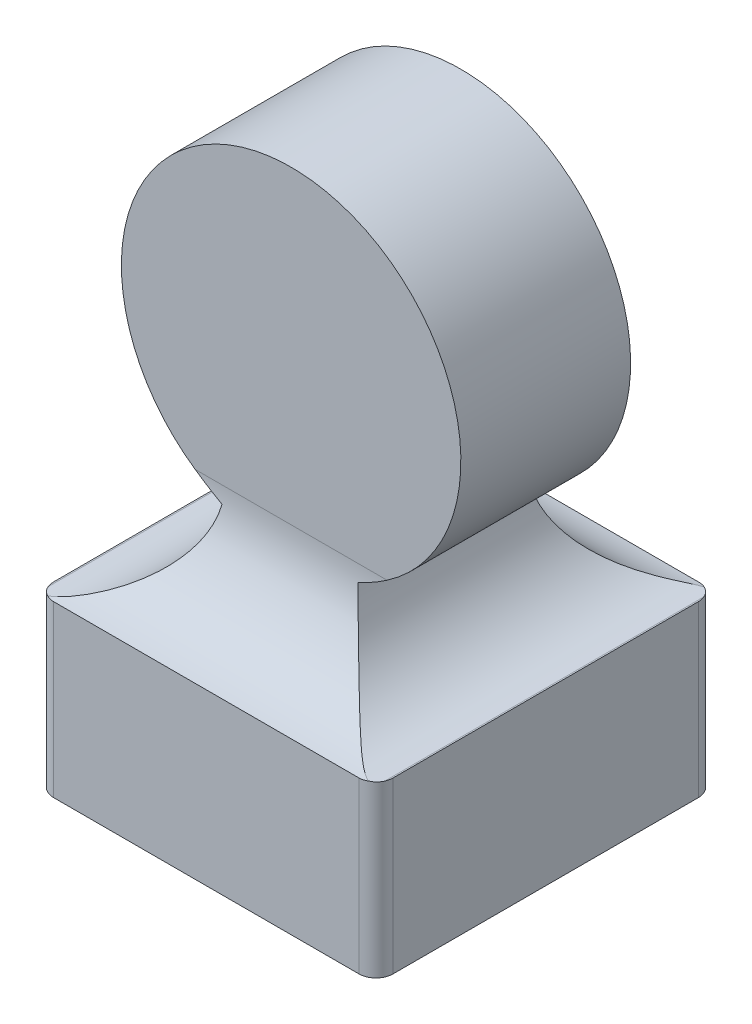
ISO-10303-21;
HEADER;
FILE_DESCRIPTION(('STEP AP214'),'2;1');
FILE_NAME('part.step','',(''),(''),'','','');
FILE_SCHEMA(('AUTOMOTIVE_DESIGN { 1 0 10303 214 1 1 1 1 }'));
ENDSEC;
DATA;
#1=APPLICATION_CONTEXT('core data for automotive mechanical design processes');
#2=APPLICATION_PROTOCOL_DEFINITION('international standard','automotive_design',2000,#1);
#3=PRODUCT_CONTEXT('',#1,'mechanical');
#4=PRODUCT('Part','Part','',(#3));
#5=PRODUCT_RELATED_PRODUCT_CATEGORY('part','',(#4));
#6=PRODUCT_DEFINITION_FORMATION('','',#4);
#7=PRODUCT_DEFINITION_CONTEXT('part definition',#1,'design');
#8=PRODUCT_DEFINITION('design','',#6,#7);
#9=PRODUCT_DEFINITION_SHAPE('','',#8);
#10=(LENGTH_UNIT() NAMED_UNIT(*) SI_UNIT(.MILLI.,.METRE.));
#11=(NAMED_UNIT(*) PLANE_ANGLE_UNIT() SI_UNIT($,.RADIAN.));
#12=(NAMED_UNIT(*) SI_UNIT($,.STERADIAN.) SOLID_ANGLE_UNIT());
#13=UNCERTAINTY_MEASURE_WITH_UNIT(LENGTH_MEASURE(1.E-05),#10,'distance_accuracy_value','');
#14=(GEOMETRIC_REPRESENTATION_CONTEXT(3) GLOBAL_UNCERTAINTY_ASSIGNED_CONTEXT((#13)) GLOBAL_UNIT_ASSIGNED_CONTEXT((#10,
#11,#12)) REPRESENTATION_CONTEXT('',''));
#15=CARTESIAN_POINT('',(0.,0.,0.));
#16=DIRECTION('',(0.,0.,1.));
#17=DIRECTION('',(1.,0.,0.));
#18=AXIS2_PLACEMENT_3D('',#15,#16,#17);
#19=CARTESIAN_POINT('',(0.,10.,0.));
#20=DIRECTION('',(0.,-1.,0.));
#21=DIRECTION('',(0.,0.,-1.));
#22=AXIS2_PLACEMENT_3D('',#19,#20,#21);
#23=PLANE('',#22);
#24=DIRECTION('',(0.,0.,1.));
#25=VECTOR('',#24,1.);
#26=CARTESIAN_POINT('',(-10.,10.,10.));
#27=LINE('',#26,#25);
#28=CARTESIAN_POINT('',(-10.,10.,-9.));
#29=VERTEX_POINT('',#28);
#30=CARTESIAN_POINT('',(-10.,10.,9.));
#31=VERTEX_POINT('',#30);
#32=EDGE_CURVE('E351',#29,#31,#27,.T.);
#33=ORIENTED_EDGE('',*,*,#32,.T.);
#34=CARTESIAN_POINT('',(-9.,10.,9.));
#35=DIRECTION('',(0.,-1.,0.));
#36=DIRECTION('',(0.,0.,-1.));
#37=AXIS2_PLACEMENT_3D('',#34,#35,#36);
#38=CIRCLE('',#37,1.);
#39=CARTESIAN_POINT('',(-9.91607978309961,10.,9.40099604860417));
#40=VERTEX_POINT('',#39);
#41=EDGE_CURVE('E276',#31,#40,#38,.F.);
#42=ORIENTED_EDGE('',*,*,#41,.T.);
#43=DIRECTION('',(0.,0.,-1.));
#44=VECTOR('',#43,1.);
#45=CARTESIAN_POINT('',(-9.91607978309961,10.,0.));
#46=LINE('',#45,#44);
#47=CARTESIAN_POINT('',(-9.91607978309961,10.,-9.40099604860417));
#48=VERTEX_POINT('',#47);
#49=EDGE_CURVE('E185',#40,#48,#46,.T.);
#50=ORIENTED_EDGE('',*,*,#49,.T.);
#51=CARTESIAN_POINT('',(-9.,10.,-9.));
#52=DIRECTION('',(0.,-1.,0.));
#53=DIRECTION('',(0.,0.,-1.));
#54=AXIS2_PLACEMENT_3D('',#51,#52,#53);
#55=CIRCLE('',#54,1.);
#56=EDGE_CURVE('E405',#48,#29,#55,.F.);
#57=ORIENTED_EDGE('',*,*,#56,.T.);
#58=EDGE_LOOP('',(#33,#42,#50,#57));
#59=FACE_BOUND('',#58,.T.);
#60=ADVANCED_FACE('F41',(#59),#23,.F.);
#61=CARTESIAN_POINT('',(10.,10.,10.));
#62=DIRECTION('',(-1.,0.,0.));
#63=DIRECTION('',(0.,0.,1.));
#64=AXIS2_PLACEMENT_3D('',#61,#62,#63);
#65=PLANE('',#64);
#66=DIRECTION('',(0.,0.,-1.));
#67=VECTOR('',#66,1.);
#68=CARTESIAN_POINT('',(10.,0.,10.));
#69=LINE('',#68,#67);
#70=CARTESIAN_POINT('',(10.,0.,9.));
#71=VERTEX_POINT('',#70);
#72=CARTESIAN_POINT('',(10.,0.,-9.));
#73=VERTEX_POINT('',#72);
#74=EDGE_CURVE('E342',#71,#73,#69,.T.);
#75=ORIENTED_EDGE('',*,*,#74,.T.);
#76=DIRECTION('',(0.,-1.,0.));
#77=VECTOR('',#76,1.);
#78=CARTESIAN_POINT('',(10.,10.,-9.));
#79=LINE('',#78,#77);
#80=CARTESIAN_POINT('',(10.,10.,-9.));
#81=VERTEX_POINT('',#80);
#82=EDGE_CURVE('E374',#73,#81,#79,.F.);
#83=ORIENTED_EDGE('',*,*,#82,.T.);
#84=DIRECTION('',(0.,0.,-1.));
#85=VECTOR('',#84,1.);
#86=CARTESIAN_POINT('',(10.,10.,10.));
#87=LINE('',#86,#85);
#88=CARTESIAN_POINT('',(10.,10.,9.));
#89=VERTEX_POINT('',#88);
#90=EDGE_CURVE('E346',#89,#81,#87,.T.);
#91=ORIENTED_EDGE('',*,*,#90,.F.);
#92=DIRECTION('',(0.,-1.,0.));
#93=VECTOR('',#92,1.);
#94=CARTESIAN_POINT('',(10.,10.,9.));
#95=LINE('',#94,#93);
#96=EDGE_CURVE('E373',#89,#71,#95,.T.);
#97=ORIENTED_EDGE('',*,*,#96,.T.);
#98=EDGE_LOOP('',(#75,#83,#91,#97));
#99=FACE_BOUND('',#98,.T.);
#100=ADVANCED_FACE('F213',(#99),#65,.F.);
#101=CARTESIAN_POINT('',(-10.,10.,-10.));
#102=DIRECTION('',(0.,0.,1.));
#103=DIRECTION('',(1.,0.,0.));
#104=AXIS2_PLACEMENT_3D('',#101,#102,#103);
#105=PLANE('',#104);
#106=DIRECTION('',(-1.,0.,0.));
#107=VECTOR('',#106,1.);
#108=CARTESIAN_POINT('',(-10.,0.,-10.));
#109=LINE('',#108,#107);
#110=CARTESIAN_POINT('',(9.00000000000001,0.,-10.));
#111=VERTEX_POINT('',#110);
#112=CARTESIAN_POINT('',(-9.,0.,-10.));
#113=VERTEX_POINT('',#112);
#114=EDGE_CURVE('E358',#111,#113,#109,.T.);
#115=ORIENTED_EDGE('',*,*,#114,.T.);
#116=DIRECTION('',(0.,-1.,0.));
#117=VECTOR('',#116,1.);
#118=CARTESIAN_POINT('',(-9.,10.,-10.));
#119=LINE('',#118,#117);
#120=CARTESIAN_POINT('',(-9.,10.,-10.));
#121=VERTEX_POINT('',#120);
#122=EDGE_CURVE('E246',#113,#121,#119,.F.);
#123=ORIENTED_EDGE('',*,*,#122,.T.);
#124=DIRECTION('',(-1.,0.,0.));
#125=VECTOR('',#124,1.);
#126=CARTESIAN_POINT('',(-10.,10.,-10.));
#127=LINE('',#126,#125);
#128=CARTESIAN_POINT('',(9.00000000000001,10.,-10.));
#129=VERTEX_POINT('',#128);
#130=EDGE_CURVE('E348',#129,#121,#127,.T.);
#131=ORIENTED_EDGE('',*,*,#130,.F.);
#132=DIRECTION('',(0.,-1.,0.));
#133=VECTOR('',#132,1.);
#134=CARTESIAN_POINT('',(9.00000000000001,10.,-10.));
#135=LINE('',#134,#133);
#136=EDGE_CURVE('E418',#129,#111,#135,.T.);
#137=ORIENTED_EDGE('',*,*,#136,.T.);
#138=EDGE_LOOP('',(#115,#123,#131,#137));
#139=FACE_BOUND('',#138,.T.);
#140=ADVANCED_FACE('F422',(#139),#105,.F.);
#141=CARTESIAN_POINT('',(-10.,10.,10.));
#142=DIRECTION('',(1.,0.,0.));
#143=DIRECTION('',(0.,0.,-1.));
#144=AXIS2_PLACEMENT_3D('',#141,#142,#143);
#145=PLANE('',#144);
#146=DIRECTION('',(0.,0.,1.));
#147=VECTOR('',#146,1.);
#148=CARTESIAN_POINT('',(-10.,0.,10.));
#149=LINE('',#148,#147);
#150=CARTESIAN_POINT('',(-10.,0.,-9.));
#151=VERTEX_POINT('',#150);
#152=CARTESIAN_POINT('',(-10.,0.,9.));
#153=VERTEX_POINT('',#152);
#154=EDGE_CURVE('E361',#151,#153,#149,.T.);
#155=ORIENTED_EDGE('',*,*,#154,.T.);
#156=DIRECTION('',(0.,-1.,0.));
#157=VECTOR('',#156,1.);
#158=CARTESIAN_POINT('',(-10.,10.,9.));
#159=LINE('',#158,#157);
#160=EDGE_CURVE('E404',#153,#31,#159,.F.);
#161=ORIENTED_EDGE('',*,*,#160,.T.);
#162=ORIENTED_EDGE('',*,*,#32,.F.);
#163=DIRECTION('',(0.,-1.,0.));
#164=VECTOR('',#163,1.);
#165=CARTESIAN_POINT('',(-10.,10.,-9.));
#166=LINE('',#165,#164);
#167=EDGE_CURVE('E401',#29,#151,#166,.T.);
#168=ORIENTED_EDGE('',*,*,#167,.T.);
#169=EDGE_LOOP('',(#155,#161,#162,#168));
#170=FACE_BOUND('',#169,.T.);
#171=ADVANCED_FACE('F426',(#170),#145,.F.);
#172=CARTESIAN_POINT('',(-10.,10.,10.));
#173=DIRECTION('',(0.,0.,-1.));
#174=DIRECTION('',(-1.,0.,0.));
#175=AXIS2_PLACEMENT_3D('',#172,#173,#174);
#176=PLANE('',#175);
#177=DIRECTION('',(1.,0.,0.));
#178=VECTOR('',#177,1.);
#179=CARTESIAN_POINT('',(-10.,10.,10.));
#180=LINE('',#179,#178);
#181=CARTESIAN_POINT('',(-9.,10.,10.));
#182=VERTEX_POINT('',#181);
#183=CARTESIAN_POINT('',(9.00000000000001,10.,10.));
#184=VERTEX_POINT('',#183);
#185=EDGE_CURVE('E354',#182,#184,#180,.T.);
#186=ORIENTED_EDGE('',*,*,#185,.F.);
#187=DIRECTION('',(0.,-1.,0.));
#188=VECTOR('',#187,1.);
#189=CARTESIAN_POINT('',(-9.,10.,10.));
#190=LINE('',#189,#188);
#191=CARTESIAN_POINT('',(-9.,0.,10.));
#192=VERTEX_POINT('',#191);
#193=EDGE_CURVE('E329',#182,#192,#190,.T.);
#194=ORIENTED_EDGE('',*,*,#193,.T.);
#195=DIRECTION('',(1.,0.,0.));
#196=VECTOR('',#195,1.);
#197=CARTESIAN_POINT('',(-10.,0.,10.));
#198=LINE('',#197,#196);
#199=CARTESIAN_POINT('',(9.00000000000001,0.,10.));
#200=VERTEX_POINT('',#199);
#201=EDGE_CURVE('E349',#192,#200,#198,.T.);
#202=ORIENTED_EDGE('',*,*,#201,.T.);
#203=DIRECTION('',(0.,-1.,0.));
#204=VECTOR('',#203,1.);
#205=CARTESIAN_POINT('',(9.00000000000001,10.,10.));
#206=LINE('',#205,#204);
#207=EDGE_CURVE('E324',#200,#184,#206,.F.);
#208=ORIENTED_EDGE('',*,*,#207,.T.);
#209=EDGE_LOOP('',(#186,#194,#202,#208));
#210=FACE_BOUND('',#209,.T.);
#211=ADVANCED_FACE('F428',(#210),#176,.F.);
#212=ORIENTED_EDGE('',*,*,#90,.T.);
#213=CARTESIAN_POINT('',(9.00000000000001,10.,-9.));
#214=DIRECTION('',(0.,-1.,0.));
#215=DIRECTION('',(0.,0.,-1.));
#216=AXIS2_PLACEMENT_3D('',#213,#214,#215);
#217=CIRCLE('',#216,1.);
#218=CARTESIAN_POINT('',(9.91607978309961,10.,-9.40099604860419));
#219=VERTEX_POINT('',#218);
#220=EDGE_CURVE('E68',#81,#219,#217,.F.);
#221=ORIENTED_EDGE('',*,*,#220,.T.);
#222=DIRECTION('',(0.,0.,-1.));
#223=VECTOR('',#222,1.);
#224=CARTESIAN_POINT('',(9.91607978309961,10.,0.));
#225=LINE('',#224,#223);
#226=CARTESIAN_POINT('',(9.91607978309961,10.,9.40099604860419));
#227=VERTEX_POINT('',#226);
#228=EDGE_CURVE('E189',#219,#227,#225,.F.);
#229=ORIENTED_EDGE('',*,*,#228,.T.);
#230=CARTESIAN_POINT('',(9.00000000000001,10.,9.));
#231=DIRECTION('',(0.,-1.,0.));
#232=DIRECTION('',(0.,0.,-1.));
#233=AXIS2_PLACEMENT_3D('',#230,#231,#232);
#234=CIRCLE('',#233,1.);
#235=EDGE_CURVE('E367',#227,#89,#234,.F.);
#236=ORIENTED_EDGE('',*,*,#235,.T.);
#237=EDGE_LOOP('',(#212,#221,#229,#236));
#238=FACE_BOUND('',#237,.T.);
#239=ADVANCED_FACE('F366',(#238),#23,.F.);
#240=CARTESIAN_POINT('',(0.,0.,0.));
#241=DIRECTION('',(0.,-1.,0.));
#242=DIRECTION('',(0.,0.,-1.));
#243=AXIS2_PLACEMENT_3D('',#240,#241,#242);
#244=PLANE('',#243);
#245=ORIENTED_EDGE('',*,*,#201,.F.);
#246=CARTESIAN_POINT('',(-9.,0.,9.));
#247=DIRECTION('',(0.,-1.,0.));
#248=DIRECTION('',(0.,0.,-1.));
#249=AXIS2_PLACEMENT_3D('',#246,#247,#248);
#250=CIRCLE('',#249,1.);
#251=EDGE_CURVE('E395',#192,#153,#250,.T.);
#252=ORIENTED_EDGE('',*,*,#251,.T.);
#253=ORIENTED_EDGE('',*,*,#154,.F.);
#254=CARTESIAN_POINT('',(-9.,0.,-9.));
#255=DIRECTION('',(0.,-1.,0.));
#256=DIRECTION('',(0.,0.,-1.));
#257=AXIS2_PLACEMENT_3D('',#254,#255,#256);
#258=CIRCLE('',#257,1.);
#259=EDGE_CURVE('E393',#151,#113,#258,.T.);
#260=ORIENTED_EDGE('',*,*,#259,.T.);
#261=ORIENTED_EDGE('',*,*,#114,.F.);
#262=CARTESIAN_POINT('',(9.00000000000001,0.,-9.));
#263=DIRECTION('',(0.,-1.,0.));
#264=DIRECTION('',(0.,0.,-1.));
#265=AXIS2_PLACEMENT_3D('',#262,#263,#264);
#266=CIRCLE('',#265,1.);
#267=EDGE_CURVE('E390',#111,#73,#266,.T.);
#268=ORIENTED_EDGE('',*,*,#267,.T.);
#269=ORIENTED_EDGE('',*,*,#74,.F.);
#270=CARTESIAN_POINT('',(9.00000000000001,0.,9.));
#271=DIRECTION('',(0.,-1.,0.));
#272=DIRECTION('',(0.,0.,-1.));
#273=AXIS2_PLACEMENT_3D('',#270,#271,#272);
#274=CIRCLE('',#273,1.);
#275=EDGE_CURVE('E388',#71,#200,#274,.T.);
#276=ORIENTED_EDGE('',*,*,#275,.T.);
#277=EDGE_LOOP('',(#245,#252,#253,#260,#261,#268,#269,#276));
#278=FACE_BOUND('',#277,.T.);
#279=ADVANCED_FACE('F387',(#278),#244,.T.);
#280=CARTESIAN_POINT('',(0.,24.1651513899117,5.));
#281=DIRECTION('',(0.,0.,-1.));
#282=DIRECTION('',(-1.,0.,0.));
#283=AXIS2_PLACEMENT_3D('',#280,#281,#282);
#284=CYLINDRICAL_SURFACE('',#283,10.);
#285=DIRECTION('',(0.,0.,-1.));
#286=VECTOR('',#285,1.);
#287=CARTESIAN_POINT('',(4.,15.,5.));
#288=LINE('',#287,#286);
#289=CARTESIAN_POINT('',(4.,15.,5.07034589280318));
#290=VERTEX_POINT('',#289);
#291=CARTESIAN_POINT('',(4.,15.,-5.07034589280318));
#292=VERTEX_POINT('',#291);
#293=EDGE_CURVE('E168',#290,#292,#288,.T.);
#294=ORIENTED_EDGE('',*,*,#293,.T.);
#295=CARTESIAN_POINT('',(4.,15.,-5.07034589280318));
#296=CARTESIAN_POINT('',(4.14455565903522,15.0630870171226,-5.06060645655739));
#297=CARTESIAN_POINT('',(4.28765102127077,15.1296126880133,-5.05135273095325));
#298=CARTESIAN_POINT('',(4.5702637863357,15.2692276453195,-5.03455494335136));
#299=CARTESIAN_POINT('',(4.70978914573242,15.3423003328963,-5.02700671956596));
#300=CARTESIAN_POINT('',(4.98532589181892,15.495011153029,-5.01430282966459));
#301=CARTESIAN_POINT('',(5.12133714992364,15.5746495253854,-5.00914725098155));
#302=CARTESIAN_POINT('',(5.38983520435226,15.7405054148941,-5.00199516509827));
#303=CARTESIAN_POINT('',(5.52231244876381,15.8267387212818,-5.00000650493054));
#304=CARTESIAN_POINT('',(5.65268233900394,15.9160797830996,-5.));
#305=B_SPLINE_CURVE_WITH_KNOTS('',3,(#295,#296,#297,#298,#299,#300,#301,#302,#303,#304),
.UNSPECIFIED.,.F.,.F.,(4,2,2,2,4),(0.,0.474033659841505,0.946897774229948,1.41977916683378,
1.89383045820883),.UNSPECIFIED.);
#306=CARTESIAN_POINT('',(5.65268233900394,15.9160797830996,-5.));
#307=VERTEX_POINT('',#306);
#308=EDGE_CURVE('E160',#292,#307,#305,.T.);
#309=ORIENTED_EDGE('',*,*,#308,.T.);
#310=CARTESIAN_POINT('',(0.,24.1651513899117,-5.));
#311=DIRECTION('',(0.,0.,1.));
#312=DIRECTION('',(1.,0.,0.));
#313=AXIS2_PLACEMENT_3D('',#310,#311,#312);
#314=CIRCLE('',#313,10.);
#315=CARTESIAN_POINT('',(-5.65268233900394,15.9160797830996,-5.));
#316=VERTEX_POINT('',#315);
#317=EDGE_CURVE('E164',#307,#316,#314,.T.);
#318=ORIENTED_EDGE('',*,*,#317,.T.);
#319=CARTESIAN_POINT('',(-5.65268233900394,15.9160797830996,-5.));
#320=CARTESIAN_POINT('',(-5.52231244876381,15.8267387212818,-5.00000650493054));
#321=CARTESIAN_POINT('',(-5.38983520435226,15.7405054148941,-5.00199516509827));
#322=CARTESIAN_POINT('',(-5.12133714992364,15.5746495253854,-5.00914725098155));
#323=CARTESIAN_POINT('',(-4.98532589181892,15.495011153029,-5.01430282966459));
#324=CARTESIAN_POINT('',(-4.70978914573242,15.3423003328963,-5.02700671956596));
#325=CARTESIAN_POINT('',(-4.5702637863357,15.2692276453195,-5.03455494335136));
#326=CARTESIAN_POINT('',(-4.28765102127077,15.1296126880133,-5.05135273095325));
#327=CARTESIAN_POINT('',(-4.14455565903522,15.0630870171226,-5.06060645655739));
#328=CARTESIAN_POINT('',(-4.,15.,-5.07034589280318));
#329=B_SPLINE_CURVE_WITH_KNOTS('',3,(#319,#320,#321,#322,#323,#324,#325,#326,#327,#328),
.UNSPECIFIED.,.F.,.F.,(4,2,2,2,4),(0.,0.474051291375053,0.94693268397888,1.41979679836732,
1.89383045820883),.UNSPECIFIED.);
#330=CARTESIAN_POINT('',(-4.,15.,-5.07034589280318));
#331=VERTEX_POINT('',#330);
#332=EDGE_CURVE('E173',#316,#331,#329,.T.);
#333=ORIENTED_EDGE('',*,*,#332,.T.);
#334=DIRECTION('',(0.,0.,-1.));
#335=VECTOR('',#334,1.);
#336=CARTESIAN_POINT('',(-4.,15.,5.));
#337=LINE('',#336,#335);
#338=CARTESIAN_POINT('',(-4.,15.,5.07034589280318));
#339=VERTEX_POINT('',#338);
#340=EDGE_CURVE('E331',#339,#331,#337,.T.);
#341=ORIENTED_EDGE('',*,*,#340,.F.);
#342=CARTESIAN_POINT('',(-4.,15.,5.07034589280318));
#343=CARTESIAN_POINT('',(-4.14455565903522,15.0630870171226,5.06060645655739));
#344=CARTESIAN_POINT('',(-4.28765102127077,15.1296126880133,5.05135273095325));
#345=CARTESIAN_POINT('',(-4.5702637863357,15.2692276453195,5.03455494335136));
#346=CARTESIAN_POINT('',(-4.70978914573242,15.3423003328963,5.02700671956596));
#347=CARTESIAN_POINT('',(-4.98532589181892,15.495011153029,5.01430282966459));
#348=CARTESIAN_POINT('',(-5.12133714992364,15.5746495253854,5.00914725098155));
#349=CARTESIAN_POINT('',(-5.38983520435226,15.7405054148941,5.00199516509827));
#350=CARTESIAN_POINT('',(-5.52231244876381,15.8267387212818,5.00000650493054));
#351=CARTESIAN_POINT('',(-5.65268233900394,15.9160797830996,5.));
#352=B_SPLINE_CURVE_WITH_KNOTS('',3,(#342,#343,#344,#345,#346,#347,#348,#349,#350,#351),
.UNSPECIFIED.,.F.,.F.,(4,2,2,2,4),(0.,0.474033659841505,0.946897774229948,1.41977916683378,
1.89383045820883),.UNSPECIFIED.);
#353=CARTESIAN_POINT('',(-5.65268233900394,15.9160797830996,5.));
#354=VERTEX_POINT('',#353);
#355=EDGE_CURVE('E319',#339,#354,#352,.T.);
#356=ORIENTED_EDGE('',*,*,#355,.T.);
#357=CARTESIAN_POINT('',(0.,24.1651513899117,5.));
#358=DIRECTION('',(0.,0.,1.));
#359=DIRECTION('',(1.,0.,0.));
#360=AXIS2_PLACEMENT_3D('',#357,#358,#359);
#361=CIRCLE('',#360,10.);
#362=CARTESIAN_POINT('',(5.65268233900394,15.9160797830996,5.));
#363=VERTEX_POINT('',#362);
#364=EDGE_CURVE('E179',#363,#354,#361,.T.);
#365=ORIENTED_EDGE('',*,*,#364,.F.);
#366=CARTESIAN_POINT('',(5.65268233900394,15.9160797830996,5.));
#367=CARTESIAN_POINT('',(5.52231244876381,15.8267387212818,5.00000650493054));
#368=CARTESIAN_POINT('',(5.38983520435226,15.7405054148941,5.00199516509827));
#369=CARTESIAN_POINT('',(5.12133714992364,15.5746495253854,5.00914725098155));
#370=CARTESIAN_POINT('',(4.98532589181892,15.495011153029,5.01430282966459));
#371=CARTESIAN_POINT('',(4.70978914573242,15.3423003328963,5.02700671956596));
#372=CARTESIAN_POINT('',(4.5702637863357,15.2692276453195,5.03455494335136));
#373=CARTESIAN_POINT('',(4.28765102127077,15.1296126880133,5.05135273095325));
#374=CARTESIAN_POINT('',(4.14455565903522,15.0630870171226,5.06060645655739));
#375=CARTESIAN_POINT('',(4.,15.,5.07034589280318));
#376=B_SPLINE_CURVE_WITH_KNOTS('',3,(#366,#367,#368,#369,#370,#371,#372,#373,#374,#375),
.UNSPECIFIED.,.F.,.F.,(4,2,2,2,4),(0.,0.474051291375053,0.94693268397888,1.41979679836732,
1.89383045820883),.UNSPECIFIED.);
#377=EDGE_CURVE('E314',#363,#290,#376,.T.);
#378=ORIENTED_EDGE('',*,*,#377,.T.);
#379=EDGE_LOOP('',(#294,#309,#318,#333,#341,#356,#365,#378));
#380=FACE_BOUND('',#379,.T.);
#381=ADVANCED_FACE('F162',(#380),#284,.T.);
#382=CARTESIAN_POINT('',(0.,0.,5.));
#383=DIRECTION('',(0.,0.,1.));
#384=DIRECTION('',(1.,0.,0.));
#385=AXIS2_PLACEMENT_3D('',#382,#383,#384);
#386=PLANE('',#385);
#387=ORIENTED_EDGE('',*,*,#364,.T.);
#388=DIRECTION('',(-1.,0.,0.));
#389=VECTOR('',#388,1.);
#390=CARTESIAN_POINT('',(4.,15.9160797830996,5.));
#391=LINE('',#390,#389);
#392=EDGE_CURVE('E174',#354,#363,#391,.F.);
#393=ORIENTED_EDGE('',*,*,#392,.T.);
#394=EDGE_LOOP('',(#387,#393));
#395=FACE_BOUND('',#394,.T.);
#396=ADVANCED_FACE('F448',(#395),#386,.T.);
#397=CARTESIAN_POINT('',(0.,0.,-5.));
#398=DIRECTION('',(0.,0.,1.));
#399=DIRECTION('',(1.,0.,0.));
#400=AXIS2_PLACEMENT_3D('',#397,#398,#399);
#401=PLANE('',#400);
#402=ORIENTED_EDGE('',*,*,#317,.F.);
#403=DIRECTION('',(-1.,0.,0.));
#404=VECTOR('',#403,1.);
#405=CARTESIAN_POINT('',(0.,15.9160797830996,-5.));
#406=LINE('',#405,#404);
#407=EDGE_CURVE('E178',#307,#316,#406,.T.);
#408=ORIENTED_EDGE('',*,*,#407,.T.);
#409=EDGE_LOOP('',(#402,#408));
#410=FACE_BOUND('',#409,.T.);
#411=ADVANCED_FACE('F177',(#410),#401,.F.);
#412=CARTESIAN_POINT('',(9.91607978309961,16.,5.));
#413=DIRECTION('',(0.,0.,-1.));
#414=DIRECTION('',(-1.,0.,0.));
#415=AXIS2_PLACEMENT_3D('',#412,#413,#414);
#416=CYLINDRICAL_SURFACE('',#415,6.);
#417=ORIENTED_EDGE('',*,*,#228,.F.);
#418=CARTESIAN_POINT('',(9.91607978309961,10.,-9.40099604860419));
#419=CARTESIAN_POINT('',(9.89330215248093,10.0000079565009,-9.4531329931132));
#420=CARTESIAN_POINT('',(9.86601637787806,10.0001290863422,-9.5032579769274));
#421=CARTESIAN_POINT('',(9.80426981402506,10.0009627781828,-9.59680921712064));
#422=CARTESIAN_POINT('',(9.77003734460634,10.0016582716528,-9.64038640537605));
#423=CARTESIAN_POINT('',(9.69203800048075,10.0040496263214,-9.7242938597286));
#424=CARTESIAN_POINT('',(9.64775326925052,10.005815659534,-9.76414572907526));
#425=CARTESIAN_POINT('',(9.57591063022215,10.0096003336336,-9.81808712205507));
#426=CARTESIAN_POINT('',(9.5506203709832,10.0110837993826,-9.8353152418035));
#427=CARTESIAN_POINT('',(9.4985894384055,10.0144855385932,-9.86737638494015));
#428=CARTESIAN_POINT('',(9.47184864419572,10.0164038483324,-9.88220920832088));
#429=CARTESIAN_POINT('',(9.44448413436557,10.0185622510892,-9.89578672366657));
#430=B_SPLINE_CURVE_WITH_KNOTS('',3,(#418,#419,#420,#421,#422,#423,#424,#425,#426,#427,#428,
#429),.UNSPECIFIED.,.F.,.F.,(4,2,2,2,2,4),(0.,0.17041000601366,0.335930767625031,
0.513691457150533,0.605487646934214,0.697291497750264),.UNSPECIFIED.);
#431=CARTESIAN_POINT('',(9.44448413436556,10.0185622510891,-9.89578672366657));
#432=VERTEX_POINT('',#431);
#433=EDGE_CURVE('E11',#219,#432,#430,.T.);
#434=ORIENTED_EDGE('',*,*,#433,.T.);
#435=CARTESIAN_POINT('',(9.91607978309961,10.,-10.));
#436=CARTESIAN_POINT('',(9.87636223094145,9.99999473342148,-10.0000595795489));
#437=CARTESIAN_POINT('',(9.83670420848328,10.0003942976675,-9.99766651425303));
#438=CARTESIAN_POINT('',(9.75808772205124,10.0019535659802,-9.9884926403144));
#439=CARTESIAN_POINT('',(9.71912690394983,10.0031098207792,-9.98173174360198));
#440=CARTESIAN_POINT('',(9.60551262440255,10.0075711654601,-9.95605992884559));
#441=CARTESIAN_POINT('',(9.53214004920084,10.0118740946337,-9.93170868840102));
#442=CARTESIAN_POINT('',(9.38235808792636,10.0232623455323,-9.87050798000223));
#443=CARTESIAN_POINT('',(9.30642067049444,10.0305895964683,-9.83262562217514));
#444=CARTESIAN_POINT('',(9.15849901561295,10.0475542109159,-9.75012106079879));
#445=CARTESIAN_POINT('',(9.08652301079182,10.0571961774075,-9.70548549424023));
#446=CARTESIAN_POINT('',(8.94401405042565,10.0788180333689,-9.61119844104357));
#447=CARTESIAN_POINT('',(8.87354843861009,10.0908450049578,-9.56145770696049));
#448=CARTESIAN_POINT('',(8.73497362736602,10.1169780845858,-9.45948179298148));
#449=CARTESIAN_POINT('',(8.66686226440909,10.1310822174351,-9.40724901434472));
#450=CARTESIAN_POINT('',(8.49299863302791,10.1701802244062,-9.27018610080639));
#451=CARTESIAN_POINT('',(8.38853602744445,10.1967177861041,-9.18416199813889));
#452=CARTESIAN_POINT('',(8.18261504473816,10.2548700466872,-9.01023856899213));
#453=CARTESIAN_POINT('',(8.08115759436549,10.2864862928559,-8.92233867813067));
#454=CARTESIAN_POINT('',(7.78007697999916,10.3890657150715,-8.65736495413747));
#455=CARTESIAN_POINT('',(7.58396641986504,10.4677091737798,-8.47919974072467));
#456=CARTESIAN_POINT('',(7.20125432989717,10.6452152813621,-8.12654412266522));
#457=CARTESIAN_POINT('',(7.01458452965234,10.7438947028105,-7.95203519681143));
#458=CARTESIAN_POINT('',(6.64951668486759,10.962658051662,-7.60808229298922));
#459=CARTESIAN_POINT('',(6.47111180744123,11.0827238853986,-7.43863417380922));
#460=CARTESIAN_POINT('',(6.17364401478302,11.3076382806655,-7.15487351333944));
#461=CARTESIAN_POINT('',(6.05222280305545,11.4069921891251,-7.03867262885723));
#462=CARTESIAN_POINT('',(5.81506716134373,11.6174380665572,-6.81124121187546));
#463=CARTESIAN_POINT('',(5.69933313935767,11.7285308758809,-6.70001103602546));
#464=CARTESIAN_POINT('',(5.36199073089614,12.0800852435571,-6.37540899007124));
#465=CARTESIAN_POINT('',(5.15011136596807,12.3389192571383,-6.17100045280147));
#466=CARTESIAN_POINT('',(4.80928186063269,12.8394159417749,-5.8423541584612));
#467=CARTESIAN_POINT('',(4.672554233905,13.0707583843015,-5.71057412877935));
#468=CARTESIAN_POINT('',(4.48884297696293,13.4380086116543,-5.53396137348573));
#469=CARTESIAN_POINT('',(4.4312218953588,13.5636460491503,-5.47865023521939));
#470=CARTESIAN_POINT('',(4.32387685116022,13.8212999314621,-5.37584433305377));
#471=CARTESIAN_POINT('',(4.27414959814374,13.9533136883187,-5.32834631207503));
#472=CARTESIAN_POINT('',(4.1797732580707,14.2340945538267,-5.23854767674022));
#473=CARTESIAN_POINT('',(4.13586618529203,14.3833509688388,-5.19698402756763));
#474=CARTESIAN_POINT('',(4.05923053775147,14.6876954258708,-5.12499153011484));
#475=CARTESIAN_POINT('',(4.02652850526208,14.8427963616094,-5.09458910833162));
#476=CARTESIAN_POINT('',(4.,15.,-5.07034589280318));
#477=B_SPLINE_CURVE_WITH_KNOTS('',3,(#435,#436,#437,#438,#439,#440,#441,#442,#443,#444,#445,
#446,#447,#448,#449,#450,#451,#452,#453,#454,#455,#456,#457,#458,#459,#460,#461,#462,#463,#464,
#465,#466,#467,#468,#469,#470,#471,#472,#473,#474,#475,#476),.UNSPECIFIED.,.F.,.F.,(4,2,2,2,2,2,
2,2,2,2,2,2,2,2,2,2,2,2,2,2,4),(0.,0.118980848376926,0.237423081964598,0.468468059942506,
0.723431767180737,0.978906750442214,1.24004420717549,1.50093493056117,1.91444785229308,
2.32808699558714,3.156235679946,3.97712700529125,4.79732709781389,5.38255321615764,
5.96782125741993,7.13774799024888,8.03205557015288,8.47821062890099,8.92417922359233,
9.4064212450984,9.88979781986929),.UNSPECIFIED.);
#478=EDGE_CURVE('E231',#292,#432,#477,.F.);
#479=ORIENTED_EDGE('',*,*,#478,.F.);
#480=ORIENTED_EDGE('',*,*,#293,.F.);
#481=CARTESIAN_POINT('',(9.91607978309961,10.,10.));
#482=CARTESIAN_POINT('',(9.87636223094145,9.99999473342148,10.0000595795489));
#483=CARTESIAN_POINT('',(9.83670420848328,10.0003942976675,9.99766651425302));
#484=CARTESIAN_POINT('',(9.75808772205125,10.0019535659802,9.98849264031439));
#485=CARTESIAN_POINT('',(9.71912690394983,10.0031098207792,9.98173174360198));
#486=CARTESIAN_POINT('',(9.60551262440256,10.0075711654601,9.95605992884559));
#487=CARTESIAN_POINT('',(9.53214004920084,10.0118740946337,9.93170868840102));
#488=CARTESIAN_POINT('',(9.38235808792636,10.0232623455323,9.87050798000224));
#489=CARTESIAN_POINT('',(9.30642067049444,10.0305895964683,9.83262562217514));
#490=CARTESIAN_POINT('',(9.15849901561296,10.0475542109159,9.75012106079878));
#491=CARTESIAN_POINT('',(9.08652301079183,10.0571961774075,9.70548549424023));
#492=CARTESIAN_POINT('',(8.94401405042566,10.0788180333689,9.61119844104357));
#493=CARTESIAN_POINT('',(8.87354843861009,10.0908450049578,9.56145770696049));
#494=CARTESIAN_POINT('',(8.73497362736602,10.1169780845858,9.45948179298149));
#495=CARTESIAN_POINT('',(8.6668622644091,10.1310822174351,9.40724901434472));
#496=CARTESIAN_POINT('',(8.49299863302791,10.1701802244062,9.27018610080639));
#497=CARTESIAN_POINT('',(8.38853602744445,10.1967177861042,9.1841619981389));
#498=CARTESIAN_POINT('',(8.18261504473816,10.2548700466872,9.01023856899213));
#499=CARTESIAN_POINT('',(8.08115759436549,10.2864862928559,8.92233867813067));
#500=CARTESIAN_POINT('',(7.78007697999916,10.3890657150715,8.65736495413747));
#501=CARTESIAN_POINT('',(7.58396641986505,10.4677091737798,8.47919974072467));
#502=CARTESIAN_POINT('',(7.20125432989717,10.6452152813621,8.12654412266522));
#503=CARTESIAN_POINT('',(7.01458452965234,10.7438947028105,7.95203519681143));
#504=CARTESIAN_POINT('',(6.64951668486759,10.962658051662,7.60808229298922));
#505=CARTESIAN_POINT('',(6.47111180744124,11.0827238853986,7.43863417380922));
#506=CARTESIAN_POINT('',(6.17364401478303,11.3076382806655,7.15487351333945));
#507=CARTESIAN_POINT('',(6.05222280305545,11.4069921891251,7.03867262885723));
#508=CARTESIAN_POINT('',(5.81506716134373,11.6174380665572,6.81124121187546));
#509=CARTESIAN_POINT('',(5.69933313935767,11.7285308758809,6.70001103602547));
#510=CARTESIAN_POINT('',(5.36199073089614,12.0800852435571,6.37540899007124));
#511=CARTESIAN_POINT('',(5.15011136596807,12.3389192571383,6.17100045280147));
#512=CARTESIAN_POINT('',(4.80928186063269,12.8394159417749,5.8423541584612));
#513=CARTESIAN_POINT('',(4.672554233905,13.0707583843015,5.71057412877935));
#514=CARTESIAN_POINT('',(4.48884297696293,13.4380086116543,5.53396137348573));
#515=CARTESIAN_POINT('',(4.43122189535879,13.5636460491503,5.47865023521939));
#516=CARTESIAN_POINT('',(4.32387685116022,13.8212999314621,5.37584433305377));
#517=CARTESIAN_POINT('',(4.27414959814374,13.9533136883187,5.32834631207503));
#518=CARTESIAN_POINT('',(4.1797732580707,14.2340945538267,5.23854767674022));
#519=CARTESIAN_POINT('',(4.13586618529203,14.3833509688388,5.19698402756763));
#520=CARTESIAN_POINT('',(4.05923053775147,14.6876954258708,5.12499153011484));
#521=CARTESIAN_POINT('',(4.02652850526208,14.8427963616094,5.09458910833162));
#522=CARTESIAN_POINT('',(4.,15.,5.07034589280318));
#523=B_SPLINE_CURVE_WITH_KNOTS('',3,(#481,#482,#483,#484,#485,#486,#487,#488,#489,#490,#491,
#492,#493,#494,#495,#496,#497,#498,#499,#500,#501,#502,#503,#504,#505,#506,#507,#508,#509,#510,
#511,#512,#513,#514,#515,#516,#517,#518,#519,#520,#521,#522),.UNSPECIFIED.,.F.,.F.,(4,2,2,2,2,2,
2,2,2,2,2,2,2,2,2,2,2,2,2,2,4),(0.,0.118980848376924,0.237423081964594,0.468468059942501,
0.723431767180732,0.978906750442209,1.24004420717549,1.50093493056117,1.91444785229308,
2.32808699558714,3.156235679946,3.97712700529125,4.79732709781389,5.38255321615764,
5.96782125741993,7.13774799024889,8.03205557015288,8.47821062890099,8.92417922359233,
9.40642124509841,9.88979781986929),.UNSPECIFIED.);
#524=CARTESIAN_POINT('',(9.44448413436558,10.0185622510891,9.89578672366657));
#525=VERTEX_POINT('',#524);
#526=EDGE_CURVE('E180',#525,#290,#523,.T.);
#527=ORIENTED_EDGE('',*,*,#526,.F.);
#528=CARTESIAN_POINT('',(9.44448413436558,10.0185622510891,9.89578672366657));
#529=CARTESIAN_POINT('',(9.49521297455758,10.01455058046,9.87066428243889));
#530=CARTESIAN_POINT('',(9.54377973327164,10.0113834502725,9.84115105802709));
#531=CARTESIAN_POINT('',(9.63398535608251,10.0064726838024,9.77528738980847));
#532=CARTESIAN_POINT('',(9.67578274220699,10.0046908932694,9.73915685699482));
#533=CARTESIAN_POINT('',(9.75594800882818,10.0019914521117,9.65732663650098));
#534=CARTESIAN_POINT('',(9.79378108317242,10.0011535329997,9.61109531984135));
#535=CARTESIAN_POINT('',(9.84443448868893,10.0004029598133,9.53654099085683));
#536=CARTESIAN_POINT('',(9.86050368208515,10.0002388175992,9.51036801495487));
#537=CARTESIAN_POINT('',(9.89017152237288,10.0000378397079,9.45665645654304));
#538=CARTESIAN_POINT('',(9.90377013925758,10.0000010055767,9.42911785745192));
#539=CARTESIAN_POINT('',(9.91607978309961,10.,9.40099604860419));
#540=B_SPLINE_CURVE_WITH_KNOTS('',3,(#528,#529,#530,#531,#532,#533,#534,#535,#536,#537,#538,
#539),.UNSPECIFIED.,.F.,.F.,(4,2,2,2,2,4),(0.,0.169958898341767,0.33505246951087,
0.513238025074057,0.605263533101848,0.697290158766421),.UNSPECIFIED.);
#541=EDGE_CURVE('E55',#525,#227,#540,.T.);
#542=ORIENTED_EDGE('',*,*,#541,.T.);
#543=EDGE_LOOP('',(#417,#434,#479,#480,#527,#542));
#544=FACE_BOUND('',#543,.T.);
#545=ADVANCED_FACE('F296',(#544),#416,.F.);
#546=CARTESIAN_POINT('',(0.,15.9160797830996,11.));
#547=DIRECTION('',(1.,0.,0.));
#548=DIRECTION('',(0.,0.,-1.));
#549=AXIS2_PLACEMENT_3D('',#546,#547,#548);
#550=CYLINDRICAL_SURFACE('',#549,6.);
#551=CARTESIAN_POINT('',(-4.,15.,5.07034589280318));
#552=CARTESIAN_POINT('',(-4.02476645410671,14.8532781675613,5.09297937601319));
#553=CARTESIAN_POINT('',(-4.05490496528425,14.7083758010922,5.12097232856508));
#554=CARTESIAN_POINT('',(-4.12505248393036,14.4234913218157,5.18679002868195));
#555=CARTESIAN_POINT('',(-4.16504703758297,14.2835023439548,5.22460038341191));
#556=CARTESIAN_POINT('',(-4.25369566777592,14.0105677277652,5.30884286274864));
#557=CARTESIAN_POINT('',(-4.30226570172759,13.8775686704727,5.35519148519707));
#558=CARTESIAN_POINT('',(-4.40744021707997,13.6178753178431,5.45584529217332));
#559=CARTESIAN_POINT('',(-4.46404748371073,13.4911832287715,5.51015323514263));
#560=CARTESIAN_POINT('',(-4.58406400512161,13.2453286065542,5.62548416083445));
#561=CARTESIAN_POINT('',(-4.64743209753668,13.1261268211824,5.68646655989617));
#562=CARTESIAN_POINT('',(-4.78039610544364,12.8947520993586,5.81453266595234));
#563=CARTESIAN_POINT('',(-4.84999140480032,12.7825784693867,5.88161576933879));
#564=CARTESIAN_POINT('',(-5.06728297887286,12.4563446171249,6.09112314994187));
#565=CARTESIAN_POINT('',(-5.22332134039699,12.2528991696335,6.24164797217172));
#566=CARTESIAN_POINT('',(-5.51565151627225,11.9165821998152,6.52329199588647));
#567=CARTESIAN_POINT('',(-5.64862837295975,11.7780732643584,6.65129264470128));
#568=CARTESIAN_POINT('',(-5.92313307408391,11.5175701878588,6.91497196588227));
#569=CARTESIAN_POINT('',(-6.06466641631748,11.395586831658,7.05065557115157));
#570=CARTESIAN_POINT('',(-6.3556406362577,11.1670171423328,7.32862659116425));
#571=CARTESIAN_POINT('',(-6.50512390194475,11.0605276858678,7.4709487745789));
#572=CARTESIAN_POINT('',(-6.81007571089013,10.8633007693703,7.75963658138218));
#573=CARTESIAN_POINT('',(-6.96553865593135,10.7725489940246,7.90599838824885));
#574=CARTESIAN_POINT('',(-7.28767034509829,10.603169703477,8.20648279441031));
#575=CARTESIAN_POINT('',(-7.45454097255204,10.5250869293804,8.36069645504401));
#576=CARTESIAN_POINT('',(-7.70974655357474,10.4196247571767,8.59246361755365));
#577=CARTESIAN_POINT('',(-7.79578376026011,10.3863673082368,8.66992727287959));
#578=CARTESIAN_POINT('',(-7.9695781317995,10.3237630432273,8.82446886559085));
#579=CARTESIAN_POINT('',(-8.05733484910626,10.2944152246851,8.90154689695699));
#580=CARTESIAN_POINT('',(-8.23389074245808,10.2399060936525,9.05384535807751));
#581=CARTESIAN_POINT('',(-8.32266679284366,10.2147010580735,9.12907694182293));
#582=CARTESIAN_POINT('',(-8.50288961789509,10.1680558309484,9.27771024328857));
#583=CARTESIAN_POINT('',(-8.59433904652383,10.1466195397886,9.35110999858803));
#584=CARTESIAN_POINT('',(-8.78026203149795,10.107725670263,9.49385989316498));
#585=CARTESIAN_POINT('',(-8.87471365728346,10.090244547108,9.56323206521072));
#586=CARTESIAN_POINT('',(-9.06883748967483,10.0593057503448,9.69511861810458));
#587=CARTESIAN_POINT('',(-9.16849709576991,10.0458388500889,9.75764851298434));
#588=CARTESIAN_POINT('',(-9.33965702734803,10.0273693170096,9.84914656185695));
#589=CARTESIAN_POINT('',(-9.40877894860648,10.0210544882746,9.88219505465441));
#590=CARTESIAN_POINT('',(-9.55074223236634,10.0107166012513,9.93816466415385));
#591=CARTESIAN_POINT('',(-9.62354415465919,10.0066732679654,9.9611749529974));
#592=CARTESIAN_POINT('',(-9.73358880697474,10.0026698107916,9.98430094074973));
#593=CARTESIAN_POINT('',(-9.76960000422395,10.0016798498059,9.99009888048457));
#594=CARTESIAN_POINT('',(-9.84241626886876,10.0003395987865,9.99799044357994));
#595=CARTESIAN_POINT('',(-9.87922570297013,9.99999615813464,10.0000443951372));
#596=CARTESIAN_POINT('',(-9.91607978309962,10.,10.));
#597=B_SPLINE_CURVE_WITH_KNOTS('',3,(#551,#552,#553,#554,#555,#556,#557,#558,#559,#560,#561,
#562,#563,#564,#565,#566,#567,#568,#569,#570,#571,#572,#573,#574,#575,#576,#577,#578,#579,#580,
#581,#582,#583,#584,#585,#586,#587,#588,#589,#590,#591,#592,#593,#594,#595,#596),.UNSPECIFIED.,
.F.,.F.,(4,2,2,2,2,2,2,2,2,2,2,2,2,2,2,2,2,2,2,2,2,2,4),(0.,0.451205960615104,0.90175412795811,
1.34810980667983,1.79462054516725,2.23855310361112,2.68244178674096,3.57140421850943,
4.2628645912182,4.9547740696403,5.65083923643872,6.34626788874557,7.06638275799643,
7.42768396449964,7.78889235031566,8.14600236460809,8.5034798145791,8.85876969971741,
9.21323654380515,9.44342006273395,9.67151495776847,9.78079253449632,9.89122144584675),.UNSPECIFIED.);
#598=CARTESIAN_POINT('',(-9.44448413436496,10.0185622510892,9.89578672366688));
#599=VERTEX_POINT('',#598);
#600=EDGE_CURVE('E301',#599,#339,#597,.F.);
#601=ORIENTED_EDGE('',*,*,#600,.F.);
#602=CARTESIAN_POINT('',(-9.44448413436496,10.0185622510892,9.89578672366688));
#603=CARTESIAN_POINT('',(-9.4194826570644,10.0162404338475,9.90819091364063));
#604=CARTESIAN_POINT('',(-9.39396181613438,10.0141533428571,9.91954993373332));
#605=CARTESIAN_POINT('',(-9.34202046385721,10.0104265107902,9.94010865999979));
#606=CARTESIAN_POINT('',(-9.31559956949814,10.0087869629066,9.94930743341222));
#607=CARTESIAN_POINT('',(-9.23632099693937,10.004567277013,9.97321568006042));
#608=CARTESIAN_POINT('',(-9.1824147453701,10.0025934749062,9.98474722058699));
#609=CARTESIAN_POINT('',(-9.106855964093,10.0009311155684,9.99450464096708));
#610=CARTESIAN_POINT('',(-9.08563886677089,10.0005832043204,9.99655488668943));
#611=CARTESIAN_POINT('',(-9.04295255497038,10.0001170267469,9.99930689377618));
#612=CARTESIAN_POINT('',(-9.02148265102558,10.0000005295537,9.99999826630042));
#613=CARTESIAN_POINT('',(-9.,10.,10.));
#614=B_SPLINE_CURVE_WITH_KNOTS('',3,(#602,#603,#604,#605,#606,#607,#608,#609,#610,#611,#612,
#613),.UNSPECIFIED.,.F.,.F.,(4,2,2,2,2,4),(0.,0.0839547808296794,0.167945745666849,
0.332503126588532,0.396427329458261,0.460838372661576),.UNSPECIFIED.);
#615=EDGE_CURVE('E289',#599,#182,#614,.T.);
#616=ORIENTED_EDGE('',*,*,#615,.T.);
#617=ORIENTED_EDGE('',*,*,#185,.T.);
#618=CARTESIAN_POINT('',(9.00000000000001,10.,10.));
#619=CARTESIAN_POINT('',(9.02800584274166,10.0000014111072,9.9999985935922));
#620=CARTESIAN_POINT('',(9.05599283401805,10.0001989366172,9.99882231822829));
#621=CARTESIAN_POINT('',(9.11177600267949,10.0009947244974,9.99412866440753));
#622=CARTESIAN_POINT('',(9.13957209367385,10.0015931575923,9.99061028858172));
#623=CARTESIAN_POINT('',(9.22128278662327,10.0039696110074,9.97674742921109));
#624=CARTESIAN_POINT('',(9.27467497769002,10.0063284955225,9.9630924732831));
#625=CARTESIAN_POINT('',(9.3465839825178,10.0107635614048,9.93826217226743));
#626=CARTESIAN_POINT('',(9.36646095288509,10.0121304608515,9.93067707576158));
#627=CARTESIAN_POINT('',(9.40582386946547,10.0151381394056,9.91420128172257));
#628=CARTESIAN_POINT('',(9.4253056858727,10.0167809246698,9.90530108269582));
#629=CARTESIAN_POINT('',(9.44448413436557,10.0185622510893,9.89578672366658));
#630=B_SPLINE_CURVE_WITH_KNOTS('',3,(#618,#619,#620,#621,#622,#623,#624,#625,#626,#627,#628,
#629),.UNSPECIFIED.,.F.,.F.,(4,2,2,2,2,4),(0.,0.083954592853479,0.167944960140442,
0.332502240807842,0.396426932932605,0.46083836797453),.UNSPECIFIED.);
#631=EDGE_CURVE('E283',#184,#525,#630,.T.);
#632=ORIENTED_EDGE('',*,*,#631,.T.);
#633=ORIENTED_EDGE('',*,*,#526,.T.);
#634=ORIENTED_EDGE('',*,*,#377,.F.);
#635=ORIENTED_EDGE('',*,*,#392,.F.);
#636=ORIENTED_EDGE('',*,*,#355,.F.);
#637=EDGE_LOOP('',(#601,#616,#617,#632,#633,#634,#635,#636));
#638=FACE_BOUND('',#637,.T.);
#639=ADVANCED_FACE('F212',(#638),#550,.F.);
#640=CARTESIAN_POINT('',(0.,15.9160797830996,-11.));
#641=DIRECTION('',(-1.,0.,0.));
#642=DIRECTION('',(0.,0.,1.));
#643=AXIS2_PLACEMENT_3D('',#640,#641,#642);
#644=CYLINDRICAL_SURFACE('',#643,6.);
#645=ORIENTED_EDGE('',*,*,#130,.T.);
#646=CARTESIAN_POINT('',(-9.,10.,-10.));
#647=CARTESIAN_POINT('',(-9.02800584274165,10.0000014111072,-9.99999859359219));
#648=CARTESIAN_POINT('',(-9.05599283401803,10.0001989366172,-9.99882231822828));
#649=CARTESIAN_POINT('',(-9.11177600267947,10.0009947244974,-9.99412866440753));
#650=CARTESIAN_POINT('',(-9.13957209367383,10.0015931575923,-9.99061028858172));
#651=CARTESIAN_POINT('',(-9.22128278662325,10.0039696110074,-9.97674742921109));
#652=CARTESIAN_POINT('',(-9.27467497769,10.0063284955225,-9.9630924732831));
#653=CARTESIAN_POINT('',(-9.34658398251705,10.0107635614048,-9.93826217226769));
#654=CARTESIAN_POINT('',(-9.36646095288363,10.0121304608514,-9.93067707576214));
#655=CARTESIAN_POINT('',(-9.4058238694626,10.0151381394053,-9.91420128172382));
#656=CARTESIAN_POINT('',(-9.42530568586914,10.0167809246695,-9.90530108269746));
#657=CARTESIAN_POINT('',(-9.44448413436135,10.0185622510889,-9.89578672366866));
#658=B_SPLINE_CURVE_WITH_KNOTS('',3,(#646,#647,#648,#649,#650,#651,#652,#653,#654,#655,#656,
#657),.UNSPECIFIED.,.F.,.F.,(4,2,2,2,2,4),(0.,0.0839545928534721,0.167944960140424,
0.332502240807837,0.396426932930266,0.460838367969816),.UNSPECIFIED.);
#659=CARTESIAN_POINT('',(-9.44448413436556,10.0185622510891,-9.89578672366657));
#660=VERTEX_POINT('',#659);
#661=EDGE_CURVE('E245',#121,#660,#658,.T.);
#662=ORIENTED_EDGE('',*,*,#661,.T.);
#663=CARTESIAN_POINT('',(-9.91607978309961,10.,-10.));
#664=CARTESIAN_POINT('',(-9.87636223094145,9.99999473342148,-10.0000595795489));
#665=CARTESIAN_POINT('',(-9.83670420848328,10.0003942976675,-9.99766651425303));
#666=CARTESIAN_POINT('',(-9.75808772205125,10.0019535659802,-9.9884926403144));
#667=CARTESIAN_POINT('',(-9.71912690394983,10.0031098207792,-9.98173174360198));
#668=CARTESIAN_POINT('',(-9.60551262440256,10.0075711654601,-9.95605992884559));
#669=CARTESIAN_POINT('',(-9.53214004920084,10.0118740946337,-9.93170868840102));
#670=CARTESIAN_POINT('',(-9.38235808792636,10.0232623455323,-9.87050798000224));
#671=CARTESIAN_POINT('',(-9.30642067049444,10.0305895964683,-9.83262562217515));
#672=CARTESIAN_POINT('',(-9.15849901561296,10.0475542109159,-9.75012106079878));
#673=CARTESIAN_POINT('',(-9.08652301079183,10.0571961774075,-9.70548549424023));
#674=CARTESIAN_POINT('',(-8.94401405042565,10.0788180333689,-9.61119844104357));
#675=CARTESIAN_POINT('',(-8.87354843861008,10.0908450049578,-9.56145770696049));
#676=CARTESIAN_POINT('',(-8.73497362736601,10.1169780845858,-9.45948179298148));
#677=CARTESIAN_POINT('',(-8.66686226440909,10.1310822174351,-9.40724901434472));
#678=CARTESIAN_POINT('',(-8.49299863302791,10.1701802244062,-9.27018610080638));
#679=CARTESIAN_POINT('',(-8.38853602744444,10.1967177861042,-9.18416199813888));
#680=CARTESIAN_POINT('',(-8.18261504473815,10.2548700466872,-9.01023856899212));
#681=CARTESIAN_POINT('',(-8.08115759436548,10.2864862928559,-8.92233867813066));
#682=CARTESIAN_POINT('',(-7.78007697999915,10.3890657150715,-8.65736495413747));
#683=CARTESIAN_POINT('',(-7.58396641986504,10.4677091737798,-8.47919974072466));
#684=CARTESIAN_POINT('',(-7.20125432989716,10.6452152813621,-8.12654412266521));
#685=CARTESIAN_POINT('',(-7.01458452965233,10.7438947028105,-7.95203519681142));
#686=CARTESIAN_POINT('',(-6.64951668486758,10.962658051662,-7.60808229298921));
#687=CARTESIAN_POINT('',(-6.47111180744123,11.0827238853986,-7.43863417380921));
#688=CARTESIAN_POINT('',(-6.17364401478302,11.3076382806655,-7.15487351333944));
#689=CARTESIAN_POINT('',(-6.05222280305544,11.4069921891251,-7.03867262885722));
#690=CARTESIAN_POINT('',(-5.81506716134372,11.6174380665572,-6.81124121187546));
#691=CARTESIAN_POINT('',(-5.69933313935766,11.7285308758809,-6.70001103602546));
#692=CARTESIAN_POINT('',(-5.36199073089614,12.0800852435571,-6.37540899007123));
#693=CARTESIAN_POINT('',(-5.15011136596806,12.3389192571383,-6.17100045280147));
#694=CARTESIAN_POINT('',(-4.80928186063268,12.8394159417749,-5.8423541584612));
#695=CARTESIAN_POINT('',(-4.672554233905,13.0707583843015,-5.71057412877935));
#696=CARTESIAN_POINT('',(-4.48884297696293,13.4380086116543,-5.53396137348572));
#697=CARTESIAN_POINT('',(-4.43122189535879,13.5636460491503,-5.47865023521939));
#698=CARTESIAN_POINT('',(-4.32387685116022,13.8212999314621,-5.37584433305377));
#699=CARTESIAN_POINT('',(-4.27414959814374,13.9533136883187,-5.32834631207503));
#700=CARTESIAN_POINT('',(-4.1797732580707,14.2340945538268,-5.23854767674021));
#701=CARTESIAN_POINT('',(-4.13586618529203,14.3833509688388,-5.19698402756762));
#702=CARTESIAN_POINT('',(-4.05923053775146,14.6876954258708,-5.12499153011484));
#703=CARTESIAN_POINT('',(-4.02652850526208,14.8427963616094,-5.09458910833162));
#704=CARTESIAN_POINT('',(-4.,15.,-5.07034589280318));
#705=B_SPLINE_CURVE_WITH_KNOTS('',3,(#663,#664,#665,#666,#667,#668,#669,#670,#671,#672,#673,
#674,#675,#676,#677,#678,#679,#680,#681,#682,#683,#684,#685,#686,#687,#688,#689,#690,#691,#692,
#693,#694,#695,#696,#697,#698,#699,#700,#701,#702,#703,#704),.UNSPECIFIED.,.F.,.F.,(4,2,2,2,2,2,
2,2,2,2,2,2,2,2,2,2,2,2,2,2,4),(0.,0.118980848376924,0.237423081964596,0.468468059942502,
0.723431767180736,0.978906750442214,1.2400442071755,1.50093493056118,1.9144478522931,
2.32808699558715,3.15623567994601,3.97712700529127,4.7973270978139,5.38255321615765,
5.96782125741995,7.1377479902489,8.03205557015288,8.478210628901,8.92417922359234,
9.40642124509841,9.8897978198693),.UNSPECIFIED.);
#706=EDGE_CURVE('E220',#331,#660,#705,.F.);
#707=ORIENTED_EDGE('',*,*,#706,.F.);
#708=ORIENTED_EDGE('',*,*,#332,.F.);
#709=ORIENTED_EDGE('',*,*,#407,.F.);
#710=ORIENTED_EDGE('',*,*,#308,.F.);
#711=ORIENTED_EDGE('',*,*,#478,.T.);
#712=CARTESIAN_POINT('',(9.44448413436557,10.0185622510891,-9.89578672366657));
#713=CARTESIAN_POINT('',(9.41948265706501,10.0162404338475,-9.90819091364034));
#714=CARTESIAN_POINT('',(9.39396181613501,10.0141533428572,-9.91954993373305));
#715=CARTESIAN_POINT('',(9.34202046385785,10.0104265107903,-9.94010865999956));
#716=CARTESIAN_POINT('',(9.31559956949879,10.0087869629066,-9.949307433412));
#717=CARTESIAN_POINT('',(9.23632099694004,10.0045672770131,-9.97321568006025));
#718=CARTESIAN_POINT('',(9.18241474537077,10.0025934749062,-9.98474722058686));
#719=CARTESIAN_POINT('',(9.10685596409358,10.0009311155684,-9.99450464096702));
#720=CARTESIAN_POINT('',(9.08563886677135,10.0005832043204,-9.99655488668939));
#721=CARTESIAN_POINT('',(9.04295255497062,10.0001170267469,-9.99930689377617));
#722=CARTESIAN_POINT('',(9.0214826510257,10.0000005295537,-9.99999826630042));
#723=CARTESIAN_POINT('',(9.00000000000001,10.,-10.));
#724=B_SPLINE_CURVE_WITH_KNOTS('',3,(#712,#713,#714,#715,#716,#717,#718,#719,#720,#721,#722,
#723),.UNSPECIFIED.,.F.,.F.,(4,2,2,2,2,4),(0.,0.0839547808296764,0.167945745666843,
0.332503126588519,0.396427329458586,0.460838372662245),.UNSPECIFIED.);
#725=EDGE_CURVE('E239',#432,#129,#724,.T.);
#726=ORIENTED_EDGE('',*,*,#725,.T.);
#727=EDGE_LOOP('',(#645,#662,#707,#708,#709,#710,#711,#726));
#728=FACE_BOUND('',#727,.T.);
#729=ADVANCED_FACE('F183',(#728),#644,.F.);
#730=CARTESIAN_POINT('',(-9.91607978309961,16.,5.));
#731=DIRECTION('',(0.,0.,-1.));
#732=DIRECTION('',(-1.,0.,0.));
#733=AXIS2_PLACEMENT_3D('',#730,#731,#732);
#734=CYLINDRICAL_SURFACE('',#733,6.);
#735=ORIENTED_EDGE('',*,*,#49,.F.);
#736=CARTESIAN_POINT('',(-9.91607978309961,10.,9.40099604860417));
#737=CARTESIAN_POINT('',(-9.89330215248093,10.0000079565009,9.45313299311319));
#738=CARTESIAN_POINT('',(-9.86601637787806,10.0001290863422,9.50325797692739));
#739=CARTESIAN_POINT('',(-9.80426981402507,10.0009627781828,9.59680921712063));
#740=CARTESIAN_POINT('',(-9.77003734460635,10.0016582716528,9.64038640537603));
#741=CARTESIAN_POINT('',(-9.69203800048068,10.0040496263214,9.72429385972867));
#742=CARTESIAN_POINT('',(-9.64775326925036,10.005815659534,9.7641457290754));
#743=CARTESIAN_POINT('',(-9.57591063022183,10.0096003336337,9.8180871220553));
#744=CARTESIAN_POINT('',(-9.55062037098283,10.0110837993826,9.83531524180375));
#745=CARTESIAN_POINT('',(-9.49858943840501,10.0144855385933,9.86737638494043));
#746=CARTESIAN_POINT('',(-9.47184864419517,10.0164038483324,9.88220920832117));
#747=CARTESIAN_POINT('',(-9.44448413436496,10.0185622510892,9.89578672366688));
#748=B_SPLINE_CURVE_WITH_KNOTS('',3,(#736,#737,#738,#739,#740,#741,#742,#743,#744,#745,#746,
#747),.UNSPECIFIED.,.F.,.F.,(4,2,2,2,2,4),(0.,0.170410006013662,0.335930767625032,
0.513691457150869,0.60548764693473,0.697291497750964),.UNSPECIFIED.);
#749=EDGE_CURVE('E275',#40,#599,#748,.T.);
#750=ORIENTED_EDGE('',*,*,#749,.T.);
#751=ORIENTED_EDGE('',*,*,#600,.T.);
#752=ORIENTED_EDGE('',*,*,#340,.T.);
#753=ORIENTED_EDGE('',*,*,#706,.T.);
#754=CARTESIAN_POINT('',(-9.44448413435974,10.0185622510896,-9.89578672366412));
#755=CARTESIAN_POINT('',(-9.49521297455343,10.0145505804603,-9.87066428243928));
#756=CARTESIAN_POINT('',(-9.54377973326824,10.0113834502727,-9.84115105802875));
#757=CARTESIAN_POINT('',(-9.63398535607968,10.0064726838026,-9.77528738981132));
#758=CARTESIAN_POINT('',(-9.67578274220404,10.0046908932695,-9.73915685699766));
#759=CARTESIAN_POINT('',(-9.75594800882575,10.0019914521118,-9.65732663650362));
#760=CARTESIAN_POINT('',(-9.79378108317059,10.0011535329998,-9.61109531984373));
#761=CARTESIAN_POINT('',(-9.84443448868786,10.0004029598133,-9.53654099085855));
#762=CARTESIAN_POINT('',(-9.86050368208433,10.0002388175992,-9.51036801495628));
#763=CARTESIAN_POINT('',(-9.89017152237251,10.0000378397079,-9.45665645654376));
#764=CARTESIAN_POINT('',(-9.90377013925741,10.0000010055767,-9.42911785745227));
#765=CARTESIAN_POINT('',(-9.91607978309961,10.,-9.40099604860417));
#766=B_SPLINE_CURVE_WITH_KNOTS('',3,(#754,#755,#756,#757,#758,#759,#760,#761,#762,#763,#764,
#765),.UNSPECIFIED.,.F.,.F.,(4,2,2,2,2,4),(0.,0.169958898341738,0.335052469510408,
0.513238025075391,0.605263533104348,0.697290158770176),.UNSPECIFIED.);
#767=EDGE_CURVE('E268',#660,#48,#766,.T.);
#768=ORIENTED_EDGE('',*,*,#767,.T.);
#769=EDGE_LOOP('',(#735,#750,#751,#752,#753,#768));
#770=FACE_BOUND('',#769,.T.);
#771=ADVANCED_FACE('F211',(#770),#734,.F.);
#772=CARTESIAN_POINT('',(-9.,10.,9.));
#773=DIRECTION('',(0.,-1.,0.));
#774=DIRECTION('',(0.,0.,-1.));
#775=AXIS2_PLACEMENT_3D('',#772,#773,#774);
#776=CYLINDRICAL_SURFACE('',#775,1.);
#777=ORIENTED_EDGE('',*,*,#41,.F.);
#778=ORIENTED_EDGE('',*,*,#160,.F.);
#779=ORIENTED_EDGE('',*,*,#251,.F.);
#780=ORIENTED_EDGE('',*,*,#193,.F.);
#781=ORIENTED_EDGE('',*,*,#615,.F.);
#782=ORIENTED_EDGE('',*,*,#749,.F.);
#783=EDGE_LOOP('',(#777,#778,#779,#780,#781,#782));
#784=FACE_BOUND('',#783,.T.);
#785=ADVANCED_FACE('F263',(#784),#776,.T.);
#786=CARTESIAN_POINT('',(-9.,10.,-9.));
#787=DIRECTION('',(0.,-1.,0.));
#788=DIRECTION('',(0.,0.,-1.));
#789=AXIS2_PLACEMENT_3D('',#786,#787,#788);
#790=CYLINDRICAL_SURFACE('',#789,1.);
#791=ORIENTED_EDGE('',*,*,#661,.F.);
#792=ORIENTED_EDGE('',*,*,#122,.F.);
#793=ORIENTED_EDGE('',*,*,#259,.F.);
#794=ORIENTED_EDGE('',*,*,#167,.F.);
#795=ORIENTED_EDGE('',*,*,#56,.F.);
#796=ORIENTED_EDGE('',*,*,#767,.F.);
#797=EDGE_LOOP('',(#791,#792,#793,#794,#795,#796));
#798=FACE_BOUND('',#797,.T.);
#799=ADVANCED_FACE('F257',(#798),#790,.T.);
#800=CARTESIAN_POINT('',(9.00000000000001,10.,-9.));
#801=DIRECTION('',(0.,-1.,0.));
#802=DIRECTION('',(0.,0.,-1.));
#803=AXIS2_PLACEMENT_3D('',#800,#801,#802);
#804=CYLINDRICAL_SURFACE('',#803,1.);
#805=ORIENTED_EDGE('',*,*,#220,.F.);
#806=ORIENTED_EDGE('',*,*,#82,.F.);
#807=ORIENTED_EDGE('',*,*,#267,.F.);
#808=ORIENTED_EDGE('',*,*,#136,.F.);
#809=ORIENTED_EDGE('',*,*,#725,.F.);
#810=ORIENTED_EDGE('',*,*,#433,.F.);
#811=EDGE_LOOP('',(#805,#806,#807,#808,#809,#810));
#812=FACE_BOUND('',#811,.T.);
#813=ADVANCED_FACE('F254',(#812),#804,.T.);
#814=CARTESIAN_POINT('',(9.00000000000001,10.,9.));
#815=DIRECTION('',(0.,-1.,0.));
#816=DIRECTION('',(0.,0.,-1.));
#817=AXIS2_PLACEMENT_3D('',#814,#815,#816);
#818=CYLINDRICAL_SURFACE('',#817,1.);
#819=ORIENTED_EDGE('',*,*,#631,.F.);
#820=ORIENTED_EDGE('',*,*,#207,.F.);
#821=ORIENTED_EDGE('',*,*,#275,.F.);
#822=ORIENTED_EDGE('',*,*,#96,.F.);
#823=ORIENTED_EDGE('',*,*,#235,.F.);
#824=ORIENTED_EDGE('',*,*,#541,.F.);
#825=EDGE_LOOP('',(#819,#820,#821,#822,#823,#824));
#826=FACE_BOUND('',#825,.T.);
#827=ADVANCED_FACE('F43',(#826),#818,.T.);
#828=CLOSED_SHELL('',(#60,#100,#140,#171,#211,#239,#279,#381,#396,#411,#545,#639,#729,#771,#785,
#799,#813,#827));
#829=MANIFOLD_SOLID_BREP('B2',#828);
#830=ADVANCED_BREP_SHAPE_REPRESENTATION('',(#18,#829),#14);
#831=SHAPE_DEFINITION_REPRESENTATION(#9,#830);
ENDSEC;
END-ISO-10303-21;
